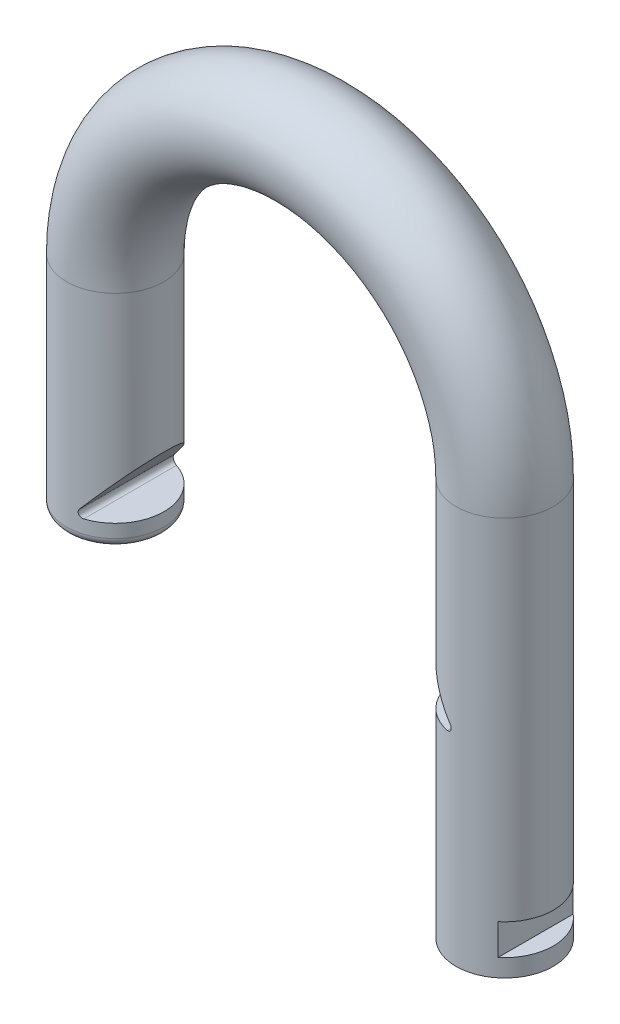
ISO-10303-21;
HEADER;
FILE_DESCRIPTION(('STEP AP214'),'2;1');
FILE_NAME('part.step','',(''),(''),'','','');
FILE_SCHEMA(('AUTOMOTIVE_DESIGN { 1 0 10303 214 1 1 1 1 }'));
ENDSEC;
DATA;
#1=APPLICATION_CONTEXT('core data for automotive mechanical design processes');
#2=APPLICATION_PROTOCOL_DEFINITION('international standard','automotive_design',2000,#1);
#3=PRODUCT_CONTEXT('',#1,'mechanical');
#4=PRODUCT('Part','Part','',(#3));
#5=PRODUCT_RELATED_PRODUCT_CATEGORY('part','',(#4));
#6=PRODUCT_DEFINITION_FORMATION('','',#4);
#7=PRODUCT_DEFINITION_CONTEXT('part definition',#1,'design');
#8=PRODUCT_DEFINITION('design','',#6,#7);
#9=PRODUCT_DEFINITION_SHAPE('','',#8);
#10=(LENGTH_UNIT() NAMED_UNIT(*) SI_UNIT(.MILLI.,.METRE.));
#11=(NAMED_UNIT(*) PLANE_ANGLE_UNIT() SI_UNIT($,.RADIAN.));
#12=(NAMED_UNIT(*) SI_UNIT($,.STERADIAN.) SOLID_ANGLE_UNIT());
#13=UNCERTAINTY_MEASURE_WITH_UNIT(LENGTH_MEASURE(1.E-05),#10,'distance_accuracy_value','');
#14=(GEOMETRIC_REPRESENTATION_CONTEXT(3) GLOBAL_UNCERTAINTY_ASSIGNED_CONTEXT((#13)) GLOBAL_UNIT_ASSIGNED_CONTEXT((#10,
#11,#12)) REPRESENTATION_CONTEXT('',''));
#15=CARTESIAN_POINT('',(0.,0.,0.));
#16=DIRECTION('',(0.,0.,1.));
#17=DIRECTION('',(1.,0.,0.));
#18=AXIS2_PLACEMENT_3D('',#15,#16,#17);
#19=CARTESIAN_POINT('',(-22.,-25.,0.));
#20=DIRECTION('',(0.,-1.,0.));
#21=DIRECTION('',(1.,0.,0.));
#22=AXIS2_PLACEMENT_3D('',#19,#20,#21);
#23=PLANE('',#22);
#24=CARTESIAN_POINT('',(-22.,-25.,0.));
#25=DIRECTION('',(0.,-1.,0.));
#26=DIRECTION('',(1.,0.,0.));
#27=AXIS2_PLACEMENT_3D('',#24,#25,#26);
#28=CIRCLE('',#27,4.5);
#29=CARTESIAN_POINT('',(-17.5,-25.,0.));
#30=VERTEX_POINT('',#29);
#31=EDGE_CURVE('E162',#30,#30,#28,.T.);
#32=ORIENTED_EDGE('',*,*,#31,.T.);
#33=EDGE_LOOP('',(#32));
#34=FACE_BOUND('',#33,.T.);
#35=ADVANCED_FACE('F53',(#34),#23,.T.);
#36=CARTESIAN_POINT('',(22.,-45.,0.));
#37=DIRECTION('',(0.,1.,0.));
#38=DIRECTION('',(-1.,0.,0.));
#39=AXIS2_PLACEMENT_3D('',#36,#37,#38);
#40=PLANE('',#39);
#41=CARTESIAN_POINT('',(22.,-45.,0.));
#42=DIRECTION('',(0.,1.,0.));
#43=DIRECTION('',(-1.,0.,0.));
#44=AXIS2_PLACEMENT_3D('',#41,#42,#43);
#45=CIRCLE('',#44,5.5);
#46=CARTESIAN_POINT('',(16.5,-45.,0.));
#47=VERTEX_POINT('',#46);
#48=EDGE_CURVE('E159',#47,#47,#45,.T.);
#49=ORIENTED_EDGE('',*,*,#48,.F.);
#50=EDGE_LOOP('',(#49));
#51=FACE_BOUND('',#50,.T.);
#52=ADVANCED_FACE('F210',(#51),#40,.F.);
#53=CARTESIAN_POINT('',(-22.,-25.,0.));
#54=DIRECTION('',(0.,1.,0.));
#55=DIRECTION('',(-1.,0.,0.));
#56=AXIS2_PLACEMENT_3D('',#53,#54,#55);
#57=CYLINDRICAL_SURFACE('',#56,5.5);
#58=CARTESIAN_POINT('',(-22.,-22.5,0.));
#59=DIRECTION('',(0.,-1.,0.));
#60=DIRECTION('',(0.,0.,-1.));
#61=AXIS2_PLACEMENT_3D('',#58,#59,#60);
#62=CIRCLE('',#61,5.5);
#63=CARTESIAN_POINT('',(-20.3246533693922,-22.5,-5.23862707847304));
#64=VERTEX_POINT('',#63);
#65=CARTESIAN_POINT('',(-20.3246533693922,-22.5,5.23862707847304));
#66=VERTEX_POINT('',#65);
#67=EDGE_CURVE('E171',#64,#66,#62,.T.);
#68=ORIENTED_EDGE('',*,*,#67,.T.);
#69=CARTESIAN_POINT('',(-20.3246533693922,-22.5,5.23862707847304));
#70=CARTESIAN_POINT('',(-20.3531942859899,-22.500022551563,5.24776469018888));
#71=CARTESIAN_POINT('',(-20.3818264589905,-22.4975567131978,5.256654524814));
#72=CARTESIAN_POINT('',(-20.4384724439636,-22.4877156708319,5.27375386631707));
#73=CARTESIAN_POINT('',(-20.4664856258961,-22.4803356831304,5.281962701508));
#74=CARTESIAN_POINT('',(-20.5210738413196,-22.4607196271261,5.29750808210329));
#75=CARTESIAN_POINT('',(-20.5476467071644,-22.4484764584815,5.30484333161006));
#76=CARTESIAN_POINT('',(-20.5984249732031,-22.4194086690633,5.31848444992605));
#77=CARTESIAN_POINT('',(-20.6226322679384,-22.4025877560724,5.32479114523842));
#78=CARTESIAN_POINT('',(-20.6671627169849,-22.3653807507671,5.33610887218874));
#79=CARTESIAN_POINT('',(-20.6875830220958,-22.3451213548472,5.34115401081369));
#80=CARTESIAN_POINT('',(-20.7247453973414,-22.3012515366069,5.35014879996462));
#81=CARTESIAN_POINT('',(-20.7414871902606,-22.2776408619522,5.3540983679335));
#82=CARTESIAN_POINT('',(-20.7702255587181,-22.2285772083116,5.36077105391441));
#83=CARTESIAN_POINT('',(-20.7823584667719,-22.2032088551656,5.36352980585013));
#84=CARTESIAN_POINT('',(-20.8022211986994,-22.1507184716995,5.36800058871218));
#85=CARTESIAN_POINT('',(-20.8099517521395,-22.1235967327839,5.36971279307776));
#86=CARTESIAN_POINT('',(-20.8206539880721,-22.0688935717011,5.37207341044266));
#87=CARTESIAN_POINT('',(-20.8237086147636,-22.0413291437847,5.37274036978831));
#88=CARTESIAN_POINT('',(-20.8252227388211,-21.9860684748587,5.37307166188213));
#89=CARTESIAN_POINT('',(-20.823682481169,-21.9583722409551,5.37273604808372));
#90=CARTESIAN_POINT('',(-20.8160816083446,-21.9038080975176,5.37106618628021));
#91=CARTESIAN_POINT('',(-20.8100477031164,-21.8769362664989,5.36973783885517));
#92=CARTESIAN_POINT('',(-20.7936822117252,-21.8246070341276,5.36608489131719));
#93=CARTESIAN_POINT('',(-20.7833518597329,-21.7991492289693,5.36376057729364));
#94=CARTESIAN_POINT('',(-20.7623473596657,-21.7575178621654,5.35894532482004));
#95=CARTESIAN_POINT('',(-20.7526598021991,-21.7408086710189,5.35670251030924));
#96=CARTESIAN_POINT('',(-20.7314815054387,-21.7086904291845,5.35172664907826));
#97=CARTESIAN_POINT('',(-20.7199935103209,-21.693279453872,5.34899434752806));
#98=CARTESIAN_POINT('',(-20.7076755909516,-21.6786061951567,5.34601698667127));
#99=B_SPLINE_CURVE_WITH_KNOTS('',3,(#69,#70,#71,#72,#73,#74,#75,#76,#77,#78,#79,#80,#81,#82,#83,
#84,#85,#86,#87,#88,#89,#90,#91,#92,#93,#94,#95,#96,#97,#98),.UNSPECIFIED.,.F.,.F.,(4,2,2,2,2,2,
2,2,2,2,2,2,2,2,4),(0.,0.089819445792922,0.179726454804668,0.269765215202741,0.359731263882757,
0.446908151506212,0.534091606591066,0.618446450350307,0.702787310598944,0.785614002674696,
0.868436278822065,0.950770155038919,1.03308039685352,1.09128650473437,1.14940474416975),.UNSPECIFIED.);
#100=CARTESIAN_POINT('',(-20.7076755909516,-21.6786061951567,5.34601698667127));
#101=VERTEX_POINT('',#100);
#102=EDGE_CURVE('E179',#66,#101,#99,.T.);
#103=ORIENTED_EDGE('',*,*,#102,.T.);
#104=CARTESIAN_POINT('',(-22.,-23.2187384524373,0.));
#105=DIRECTION('',(-0.766044443118975,0.642787609686543,0.));
#106=DIRECTION('',(0.642787609686543,0.766044443118975,0.));
#107=AXIS2_PLACEMENT_3D('',#104,#105,#106);
#108=ELLIPSE('',#107,8.55648104773221,5.5);
#109=CARTESIAN_POINT('',(-20.7076755909516,-21.6786061951567,-5.34601698667127));
#110=VERTEX_POINT('',#109);
#111=EDGE_CURVE('E168',#101,#110,#108,.T.);
#112=ORIENTED_EDGE('',*,*,#111,.T.);
#113=CARTESIAN_POINT('',(-20.7076755909516,-21.6786061951567,-5.34601698667127));
#114=CARTESIAN_POINT('',(-20.7253144779136,-21.6995856037376,-5.35027858810851));
#115=CARTESIAN_POINT('',(-20.7412367686181,-21.7221073342642,-5.35403719790776));
#116=CARTESIAN_POINT('',(-20.7692259905756,-21.7695519197623,-5.36054185687407));
#117=CARTESIAN_POINT('',(-20.7812943684395,-21.7944738692009,-5.36328828603464));
#118=CARTESIAN_POINT('',(-20.8011758170494,-21.8460737899667,-5.36776709517073));
#119=CARTESIAN_POINT('',(-20.808985309532,-21.8727532168789,-5.36949862252923));
#120=CARTESIAN_POINT('',(-20.8200816081314,-21.9270718787896,-5.3719480369776));
#121=CARTESIAN_POINT('',(-20.8233700085153,-21.954710771926,-5.37266628138255));
#122=CARTESIAN_POINT('',(-20.8253117767726,-22.0099400890561,-5.37309114445747));
#123=CARTESIAN_POINT('',(-20.824001456236,-22.037529179465,-5.37280568833328));
#124=CARTESIAN_POINT('',(-20.8168687500099,-22.0920929251263,-5.37123948172719));
#125=CARTESIAN_POINT('',(-20.81104567388,-22.1190674857071,-5.36995857894435));
#126=CARTESIAN_POINT('',(-20.7950865337713,-22.1715955900931,-5.36640006794409));
#127=CARTESIAN_POINT('',(-20.7849567384116,-22.1971511384476,-5.36412390823039));
#128=CARTESIAN_POINT('',(-20.7607104072627,-22.2461749502945,-5.35857399117198));
#129=CARTESIAN_POINT('',(-20.7465939132444,-22.269643235653,-5.35530024427952));
#130=CARTESIAN_POINT('',(-20.7146871873469,-22.3140499092629,-5.34773233311966));
#131=CARTESIAN_POINT('',(-20.696867229526,-22.3349655073093,-5.34342986693873));
#132=CARTESIAN_POINT('',(-20.6581889295066,-22.3734960342066,-5.33384844162065));
#133=CARTESIAN_POINT('',(-20.6373307379473,-22.3911111266014,-5.32856953089324));
#134=CARTESIAN_POINT('',(-20.5927617217232,-22.4229455333942,-5.31697471943173));
#135=CARTESIAN_POINT('',(-20.5690019419152,-22.437089386023,-5.31064008985625));
#136=CARTESIAN_POINT('',(-20.5196750104844,-22.4612166953199,-5.29710227668523));
#137=CARTESIAN_POINT('',(-20.4941071057525,-22.471198406318,-5.28989873028162));
#138=CARTESIAN_POINT('',(-20.4446283552701,-22.4860054088124,-5.27554816872116));
#139=CARTESIAN_POINT('',(-20.4208232808513,-22.4912603150756,-5.26847380289965));
#140=CARTESIAN_POINT('',(-20.372876840213,-22.4982600465503,-5.25386629094413));
#141=CARTESIAN_POINT('',(-20.3487359908172,-22.5000097699994,-5.24633380020485));
#142=CARTESIAN_POINT('',(-20.3246533693922,-22.5,-5.23862707847304));
#143=B_SPLINE_CURVE_WITH_KNOTS('',3,(#113,#114,#115,#116,#117,#118,#119,#120,#121,#122,#123,
#124,#125,#126,#127,#128,#129,#130,#131,#132,#133,#134,#135,#136,#137,#138,#139,#140,#141,#142),
.UNSPECIFIED.,.F.,.F.,(4,2,2,2,2,2,2,2,2,2,2,2,2,2,4),(0.,0.0831172446899611,0.166203253587353,
0.249358963203957,0.332485342196754,0.414956835402669,0.497440949032709,0.579805412239336,
0.662169012499062,0.745221174599691,0.828269220278354,0.912988351924148,0.997742980498233,
1.07364705089344,1.14944497667795),.UNSPECIFIED.);
#144=EDGE_CURVE('E186',#110,#64,#143,.T.);
#145=ORIENTED_EDGE('',*,*,#144,.T.);
#146=EDGE_LOOP('',(#68,#103,#112,#145));
#147=FACE_BOUND('',#146,.T.);
#148=CARTESIAN_POINT('',(-22.,-24.,0.));
#149=DIRECTION('',(0.,-1.,0.));
#150=DIRECTION('',(1.,0.,0.));
#151=AXIS2_PLACEMENT_3D('',#148,#149,#150);
#152=CIRCLE('',#151,5.5);
#153=CARTESIAN_POINT('',(-16.5,-24.,0.));
#154=VERTEX_POINT('',#153);
#155=EDGE_CURVE('E165',#154,#154,#152,.F.);
#156=ORIENTED_EDGE('',*,*,#155,.T.);
#157=EDGE_LOOP('',(#156));
#158=FACE_BOUND('',#157,.T.);
#159=CARTESIAN_POINT('',(-22.,0.,0.));
#160=DIRECTION('',(0.,-1.,0.));
#161=DIRECTION('',(1.,0.,0.));
#162=AXIS2_PLACEMENT_3D('',#159,#160,#161);
#163=CIRCLE('',#162,5.5);
#164=CARTESIAN_POINT('',(-27.5,0.,0.));
#165=VERTEX_POINT('',#164);
#166=EDGE_CURVE('E151',#165,#165,#163,.T.);
#167=ORIENTED_EDGE('',*,*,#166,.T.);
#168=EDGE_LOOP('',(#167));
#169=FACE_BOUND('',#168,.T.);
#170=ADVANCED_FACE('F192',(#147,#158,#169),#57,.T.);
#171=CARTESIAN_POINT('',(0.,0.,0.));
#172=DIRECTION('',(0.,0.,-1.));
#173=DIRECTION('',(-1.,0.,0.));
#174=AXIS2_PLACEMENT_3D('',#171,#172,#173);
#175=TOROIDAL_SURFACE('',#174,22.,5.5);
#176=CARTESIAN_POINT('',(22.,0.,0.));
#177=DIRECTION('',(0.,1.,0.));
#178=DIRECTION('',(-1.,0.,0.));
#179=AXIS2_PLACEMENT_3D('',#176,#177,#178);
#180=CIRCLE('',#179,5.5);
#181=CARTESIAN_POINT('',(27.5,0.,0.));
#182=VERTEX_POINT('',#181);
#183=EDGE_CURVE('E156',#182,#182,#180,.T.);
#184=CARTESIAN_POINT('',(0.,0.,0.));
#185=DIRECTION('',(0.,0.,-1.));
#186=DIRECTION('',(-1.,0.,0.));
#187=AXIS2_PLACEMENT_3D('',#184,#185,#186);
#188=CIRCLE('',#187,27.5);
#189=EDGE_CURVE('',#165,#182,#188,.T.);
#190=ORIENTED_EDGE('',*,*,#166,.F.);
#191=ORIENTED_EDGE('',*,*,#183,.T.);
#192=ORIENTED_EDGE('',*,*,#189,.T.);
#193=ORIENTED_EDGE('',*,*,#189,.F.);
#194=EDGE_LOOP('',(#190,#192,#191,#193));
#195=FACE_BOUND('',#194,.T.);
#196=ADVANCED_FACE('F216',(#195),#175,.T.);
#197=CARTESIAN_POINT('',(22.,0.,0.));
#198=DIRECTION('',(0.,-1.,0.));
#199=DIRECTION('',(1.,0.,0.));
#200=AXIS2_PLACEMENT_3D('',#197,#198,#199);
#201=CYLINDRICAL_SURFACE('',#200,5.5);
#202=CARTESIAN_POINT('',(22.,-22.5,0.));
#203=DIRECTION('',(0.766044443118974,0.642787609686544,0.));
#204=DIRECTION('',(0.642787609686544,-0.766044443118974,0.));
#205=AXIS2_PLACEMENT_3D('',#202,#203,#204);
#206=ELLIPSE('',#205,8.55648104773221,5.5);
#207=CARTESIAN_POINT('',(21.3107687613047,-21.6786061951567,-5.45664368450117));
#208=VERTEX_POINT('',#207);
#209=CARTESIAN_POINT('',(21.3107687613047,-21.6786061951567,5.45664368450117));
#210=VERTEX_POINT('',#209);
#211=EDGE_CURVE('E227',#208,#210,#206,.T.);
#212=ORIENTED_EDGE('',*,*,#211,.T.);
#213=CARTESIAN_POINT('',(21.3107687613047,-21.6786061951567,5.45664368450117));
#214=CARTESIAN_POINT('',(21.3287299787529,-21.6999723772352,5.4589096903419));
#215=CARTESIAN_POINT('',(21.3448755677556,-21.7228872415483,5.46086130726621));
#216=CARTESIAN_POINT('',(21.373140952345,-21.7710956397247,5.4641795780334));
#217=CARTESIAN_POINT('',(21.3852635943498,-21.7963874754439,5.46554664566994));
#218=CARTESIAN_POINT('',(21.4051202348957,-21.8486769133682,5.4677432854613));
#219=CARTESIAN_POINT('',(21.4128519631883,-21.8756753899614,5.4685725796007));
#220=CARTESIAN_POINT('',(21.4236948798459,-21.9305889311971,5.46972604352594));
#221=CARTESIAN_POINT('',(21.4268070188427,-21.9585038060519,5.47005031723695));
#222=CARTESIAN_POINT('',(21.4283198721341,-22.0144361976606,5.47020861774264));
#223=CARTESIAN_POINT('',(21.4267250072467,-22.0424535934358,5.47004310454479));
#224=CARTESIAN_POINT('',(21.4188801068889,-22.0978252676087,5.46921520886566));
#225=CARTESIAN_POINT('',(21.4126294289591,-22.1251794539515,5.46855275781144));
#226=CARTESIAN_POINT('',(21.3956568926565,-22.1784404363333,5.46670300092223));
#227=CARTESIAN_POINT('',(21.3849356811112,-22.2043474411458,5.46551577101436));
#228=CARTESIAN_POINT('',(21.3593386913877,-22.2539841126444,5.46257432516157));
#229=CARTESIAN_POINT('',(21.3444630444365,-22.2777138480729,5.46082012712533));
#230=CARTESIAN_POINT('',(21.3109819569861,-22.3223502512244,5.45669661682108));
#231=CARTESIAN_POINT('',(21.2923731233637,-22.3432543215348,5.45432674437944));
#232=CARTESIAN_POINT('',(21.2519867357351,-22.3816336421922,5.44893477593634));
#233=CARTESIAN_POINT('',(21.2302093166638,-22.3991090384756,5.44591270770615));
#234=CARTESIAN_POINT('',(21.1840339116943,-22.4302270126905,5.43918607291201));
#235=CARTESIAN_POINT('',(21.1596254939479,-22.4438534950027,5.43547874446739));
#236=CARTESIAN_POINT('',(21.1089712169541,-22.4668305280152,5.4274049727146));
#237=CARTESIAN_POINT('',(21.0827254402953,-22.4761812707661,5.42303855902186));
#238=CARTESIAN_POINT('',(21.0349866631256,-22.4888457773623,5.41472078396018));
#239=CARTESIAN_POINT('',(21.0136991464237,-22.4930295310083,5.41088517781613));
#240=CARTESIAN_POINT('',(20.9708491271677,-22.4986078795114,5.40290020562981));
#241=CARTESIAN_POINT('',(20.9492870263887,-22.500006163043,5.3987512620981));
#242=CARTESIAN_POINT('',(20.9277465397452,-22.5,5.39446684269832));
#243=B_SPLINE_CURVE_WITH_KNOTS('',3,(#213,#214,#215,#216,#217,#218,#219,#220,#221,#222,#223,
#224,#225,#226,#227,#228,#229,#230,#231,#232,#233,#234,#235,#236,#237,#238,#239,#240,#241,#242),
.UNSPECIFIED.,.F.,.F.,(4,2,2,2,2,2,2,2,2,2,2,2,2,2,4),(0.,0.083903439310357,0.167747385910296,
0.25163464324536,0.335504635635565,0.41929588240549,0.503098693740018,0.586889384113204,
0.670677428069336,0.754541975520647,0.838402952627039,0.922609600877212,1.00681246650056,
1.07273128066602,1.13856274328547),.UNSPECIFIED.);
#244=CARTESIAN_POINT('',(20.9277465397452,-22.5,5.39446684269832));
#245=VERTEX_POINT('',#244);
#246=EDGE_CURVE('E67',#210,#245,#243,.T.);
#247=ORIENTED_EDGE('',*,*,#246,.T.);
#248=CARTESIAN_POINT('',(22.,-22.5,0.));
#249=DIRECTION('',(0.,-1.,0.));
#250=DIRECTION('',(0.,0.,-1.));
#251=AXIS2_PLACEMENT_3D('',#248,#249,#250);
#252=CIRCLE('',#251,5.5);
#253=CARTESIAN_POINT('',(20.9277465397452,-22.5,-5.39446684269832));
#254=VERTEX_POINT('',#253);
#255=EDGE_CURVE('E139',#245,#254,#252,.T.);
#256=ORIENTED_EDGE('',*,*,#255,.T.);
#257=CARTESIAN_POINT('',(20.9277465397452,-22.5,-5.39446684269832));
#258=CARTESIAN_POINT('',(20.9558756391049,-22.5000242321586,-5.40006689266161));
#259=CARTESIAN_POINT('',(20.9840533453058,-22.4976272797476,-5.40543040917255));
#260=CARTESIAN_POINT('',(21.0397028857107,-22.4881148333304,-5.41558897784766));
#261=CARTESIAN_POINT('',(21.067174788062,-22.4809997966595,-5.420384085056));
#262=CARTESIAN_POINT('',(21.1206404524423,-22.4621661404211,-5.42931574544452));
#263=CARTESIAN_POINT('',(21.1466328043198,-22.4504432104987,-5.43345167690685));
#264=CARTESIAN_POINT('',(21.1963150380691,-22.4227050327951,-5.44102201853974));
#265=CARTESIAN_POINT('',(21.2200059334541,-22.4066916862065,-5.44445673825007));
#266=CARTESIAN_POINT('',(21.2640916805081,-22.3710334971277,-5.45058984237723));
#267=CARTESIAN_POINT('',(21.2845238226662,-22.3514362400298,-5.45329684419811));
#268=CARTESIAN_POINT('',(21.3218263459245,-22.3090284688951,-5.45806146482139));
#269=CARTESIAN_POINT('',(21.3386962060944,-22.286217485711,-5.46011898866908));
#270=CARTESIAN_POINT('',(21.3682138951935,-22.2382719105059,-5.46361290645277));
#271=CARTESIAN_POINT('',(21.3809006747765,-22.2131617088874,-5.46505506971731));
#272=CARTESIAN_POINT('',(21.40189512572,-22.1611505452868,-5.46739268631762));
#273=CARTESIAN_POINT('',(21.4102030948949,-22.1342497052311,-5.4682881768347));
#274=CARTESIAN_POINT('',(21.4221758606652,-22.0795118267394,-5.46956632459768));
#275=CARTESIAN_POINT('',(21.4258552518623,-22.0516780165491,-5.46995059402219));
#276=CARTESIAN_POINT('',(21.4285108890881,-21.9957836215151,-5.47022870346085));
#277=CARTESIAN_POINT('',(21.427487092879,-21.9677230346371,-5.47012253907059));
#278=CARTESIAN_POINT('',(21.4207690647692,-21.9121875379415,-5.46941520810083));
#279=CARTESIAN_POINT('',(21.4150768682183,-21.8847123782417,-5.46881425724008));
#280=CARTESIAN_POINT('',(21.3991895371502,-21.8311156490565,-5.46709155147751));
#281=CARTESIAN_POINT('',(21.3889959745947,-21.8049936105909,-5.46596997837979));
#282=CARTESIAN_POINT('',(21.3678053518878,-21.761760412499,-5.46355284233099));
#283=CARTESIAN_POINT('',(21.3578008721918,-21.7441473509513,-5.46239003567542));
#284=CARTESIAN_POINT('',(21.3357651707135,-21.7102944890597,-5.45975400013269));
#285=CARTESIAN_POINT('',(21.3237364505193,-21.6940530304272,-5.4582811538405));
#286=CARTESIAN_POINT('',(21.3107687613047,-21.6786061951567,-5.45664368450117));
#287=B_SPLINE_CURVE_WITH_KNOTS('',3,(#257,#258,#259,#260,#261,#262,#263,#264,#265,#266,#267,
#268,#269,#270,#271,#272,#273,#274,#275,#276,#277,#278,#279,#280,#281,#282,#283,#284,#285,#286),
.UNSPECIFIED.,.F.,.F.,(4,2,2,2,2,2,2,2,2,2,2,2,2,2,4),(0.,0.0859450697510039,0.171881809857943,
0.257899129690117,0.343878395924552,0.428789542501741,0.513713097478665,0.597821955349412,
0.681925092016957,0.765762368668507,0.849600398234579,0.933401895141887,1.0171741501048,
1.07789949039444,1.13855032917283),.UNSPECIFIED.);
#288=EDGE_CURVE('E12',#254,#208,#287,.T.);
#289=ORIENTED_EDGE('',*,*,#288,.T.);
#290=EDGE_LOOP('',(#212,#247,#256,#289));
#291=FACE_BOUND('',#290,.T.);
#292=DIRECTION('',(0.,-1.,0.));
#293=VECTOR('',#292,1.);
#294=CARTESIAN_POINT('',(25.5,0.,-4.24264068711924));
#295=LINE('',#294,#293);
#296=CARTESIAN_POINT('',(25.5,-39.5,-4.24264068711928));
#297=VERTEX_POINT('',#296);
#298=CARTESIAN_POINT('',(25.5,-43.,-4.24264068711924));
#299=VERTEX_POINT('',#298);
#300=EDGE_CURVE('E232',#297,#299,#295,.T.);
#301=ORIENTED_EDGE('',*,*,#300,.T.);
#302=CARTESIAN_POINT('',(22.,-43.,0.));
#303=DIRECTION('',(0.,-1.,0.));
#304=DIRECTION('',(0.,0.,-1.));
#305=AXIS2_PLACEMENT_3D('',#302,#303,#304);
#306=CIRCLE('',#305,5.5);
#307=CARTESIAN_POINT('',(25.5,-43.,4.24264068711925));
#308=VERTEX_POINT('',#307);
#309=EDGE_CURVE('E140',#299,#308,#306,.T.);
#310=ORIENTED_EDGE('',*,*,#309,.T.);
#311=DIRECTION('',(0.,-1.,0.));
#312=VECTOR('',#311,1.);
#313=CARTESIAN_POINT('',(25.5,0.,4.24264068711924));
#314=LINE('',#313,#312);
#315=CARTESIAN_POINT('',(25.5,-39.5,4.24264068711928));
#316=VERTEX_POINT('',#315);
#317=EDGE_CURVE('E235',#308,#316,#314,.F.);
#318=ORIENTED_EDGE('',*,*,#317,.T.);
#319=CARTESIAN_POINT('',(22.,-39.5,0.));
#320=DIRECTION('',(0.,1.,0.));
#321=DIRECTION('',(-1.,0.,0.));
#322=AXIS2_PLACEMENT_3D('',#319,#320,#321);
#323=CIRCLE('',#322,5.5);
#324=EDGE_CURVE('E238',#316,#297,#323,.T.);
#325=ORIENTED_EDGE('',*,*,#324,.T.);
#326=EDGE_LOOP('',(#301,#310,#318,#325));
#327=FACE_BOUND('',#326,.T.);
#328=CARTESIAN_POINT('',(22.,-30.5207259421637,0.));
#329=DIRECTION('',(0.499999999999997,0.86602540378444,0.));
#330=DIRECTION('',(0.86602540378444,-0.499999999999997,0.));
#331=AXIS2_PLACEMENT_3D('',#328,#329,#330);
#332=ELLIPSE('',#331,6.35085296108587,5.5);
#333=CARTESIAN_POINT('',(18.5,-28.5,-4.24264068711929));
#334=VERTEX_POINT('',#333);
#335=CARTESIAN_POINT('',(18.5,-28.5,4.24264068711929));
#336=VERTEX_POINT('',#335);
#337=EDGE_CURVE('E127',#334,#336,#332,.T.);
#338=ORIENTED_EDGE('',*,*,#337,.T.);
#339=DIRECTION('',(0.,-1.,0.));
#340=VECTOR('',#339,1.);
#341=CARTESIAN_POINT('',(18.5,0.,4.24264068711926));
#342=LINE('',#341,#340);
#343=CARTESIAN_POINT('',(18.5,-43.,4.24264068711929));
#344=VERTEX_POINT('',#343);
#345=EDGE_CURVE('E133',#336,#344,#342,.T.);
#346=ORIENTED_EDGE('',*,*,#345,.T.);
#347=CARTESIAN_POINT('',(22.,-43.,0.));
#348=DIRECTION('',(0.,-1.,0.));
#349=DIRECTION('',(0.,0.,-1.));
#350=AXIS2_PLACEMENT_3D('',#347,#348,#349);
#351=CIRCLE('',#350,5.5);
#352=CARTESIAN_POINT('',(18.5,-43.,-4.24264068711929));
#353=VERTEX_POINT('',#352);
#354=EDGE_CURVE('E129',#344,#353,#351,.T.);
#355=ORIENTED_EDGE('',*,*,#354,.T.);
#356=DIRECTION('',(0.,-1.,0.));
#357=VECTOR('',#356,1.);
#358=CARTESIAN_POINT('',(18.5,0.,-4.24264068711926));
#359=LINE('',#358,#357);
#360=EDGE_CURVE('E122',#353,#334,#359,.F.);
#361=ORIENTED_EDGE('',*,*,#360,.T.);
#362=EDGE_LOOP('',(#338,#346,#355,#361));
#363=FACE_BOUND('',#362,.T.);
#364=ORIENTED_EDGE('',*,*,#48,.T.);
#365=EDGE_LOOP('',(#364));
#366=FACE_BOUND('',#365,.T.);
#367=ORIENTED_EDGE('',*,*,#183,.F.);
#368=EDGE_LOOP('',(#367));
#369=FACE_BOUND('',#368,.T.);
#370=ADVANCED_FACE('F124',(#291,#327,#363,#366,#369),#201,.T.);
#371=CARTESIAN_POINT('',(-22.,-24.,0.));
#372=DIRECTION('',(0.,-1.,0.));
#373=DIRECTION('',(1.,0.,0.));
#374=AXIS2_PLACEMENT_3D('',#371,#372,#373);
#375=TOROIDAL_SURFACE('',#374,4.5,1.);
#376=ORIENTED_EDGE('',*,*,#155,.F.);
#377=EDGE_LOOP('',(#376));
#378=FACE_BOUND('',#377,.T.);
#379=ORIENTED_EDGE('',*,*,#31,.F.);
#380=EDGE_LOOP('',(#379));
#381=FACE_BOUND('',#380,.T.);
#382=ADVANCED_FACE('F202',(#378,#381),#375,.T.);
#383=CARTESIAN_POINT('',(-16.5,-22.5,-5.5));
#384=DIRECTION('',(0.,-1.,0.));
#385=DIRECTION('',(0.,0.,-1.));
#386=AXIS2_PLACEMENT_3D('',#383,#384,#385);
#387=PLANE('',#386);
#388=ORIENTED_EDGE('',*,*,#67,.F.);
#389=DIRECTION('',(0.,0.,1.));
#390=VECTOR('',#389,1.);
#391=CARTESIAN_POINT('',(-20.3246533693922,-22.5,5.46683442477212));
#392=LINE('',#391,#390);
#393=EDGE_CURVE('E174',#64,#66,#392,.T.);
#394=ORIENTED_EDGE('',*,*,#393,.T.);
#395=EDGE_LOOP('',(#388,#394));
#396=FACE_BOUND('',#395,.T.);
#397=ADVANCED_FACE('F206',(#396),#387,.F.);
#398=CARTESIAN_POINT('',(-21.3969068296469,-22.5,-5.5));
#399=DIRECTION('',(-0.766044443118975,0.642787609686543,0.));
#400=DIRECTION('',(-0.642787609686543,-0.766044443118975,0.));
#401=AXIS2_PLACEMENT_3D('',#398,#399,#400);
#402=PLANE('',#401);
#403=ORIENTED_EDGE('',*,*,#111,.F.);
#404=DIRECTION('',(0.,0.,1.));
#405=VECTOR('',#404,1.);
#406=CARTESIAN_POINT('',(-20.7076755909516,-21.6786061951567,-5.46683442477212));
#407=LINE('',#406,#405);
#408=EDGE_CURVE('E177',#101,#110,#407,.F.);
#409=ORIENTED_EDGE('',*,*,#408,.T.);
#410=EDGE_LOOP('',(#403,#409));
#411=FACE_BOUND('',#410,.T.);
#412=ADVANCED_FACE('F200',(#411),#402,.F.);
#413=CARTESIAN_POINT('',(-20.3246533693922,-22.,-5.5));
#414=DIRECTION('',(0.,0.,-1.));
#415=DIRECTION('',(-1.,0.,0.));
#416=AXIS2_PLACEMENT_3D('',#413,#414,#415);
#417=CYLINDRICAL_SURFACE('',#416,0.5);
#418=ORIENTED_EDGE('',*,*,#144,.F.);
#419=ORIENTED_EDGE('',*,*,#408,.F.);
#420=ORIENTED_EDGE('',*,*,#102,.F.);
#421=ORIENTED_EDGE('',*,*,#393,.F.);
#422=EDGE_LOOP('',(#418,#419,#420,#421));
#423=FACE_BOUND('',#422,.T.);
#424=ADVANCED_FACE('F196',(#423),#417,.F.);
#425=CARTESIAN_POINT('',(18.5,-43.,-5.5));
#426=DIRECTION('',(1.,0.,0.));
#427=DIRECTION('',(0.,1.,0.));
#428=AXIS2_PLACEMENT_3D('',#425,#426,#427);
#429=PLANE('',#428);
#430=ORIENTED_EDGE('',*,*,#345,.F.);
#431=DIRECTION('',(0.,0.,1.));
#432=VECTOR('',#431,1.);
#433=CARTESIAN_POINT('',(18.5,-28.5,-5.5));
#434=LINE('',#433,#432);
#435=EDGE_CURVE('E138',#334,#336,#434,.T.);
#436=ORIENTED_EDGE('',*,*,#435,.F.);
#437=ORIENTED_EDGE('',*,*,#360,.F.);
#438=DIRECTION('',(0.,0.,1.));
#439=VECTOR('',#438,1.);
#440=CARTESIAN_POINT('',(18.5,-43.,-5.5));
#441=LINE('',#440,#439);
#442=EDGE_CURVE('E143',#353,#344,#441,.T.);
#443=ORIENTED_EDGE('',*,*,#442,.T.);
#444=EDGE_LOOP('',(#430,#436,#437,#443));
#445=FACE_BOUND('',#444,.T.);
#446=ADVANCED_FACE('F142',(#445),#429,.F.);
#447=CARTESIAN_POINT('',(16.5,-43.,-5.5));
#448=DIRECTION('',(0.,-1.,0.));
#449=DIRECTION('',(0.,0.,-1.));
#450=AXIS2_PLACEMENT_3D('',#447,#448,#449);
#451=PLANE('',#450);
#452=ORIENTED_EDGE('',*,*,#442,.F.);
#453=ORIENTED_EDGE('',*,*,#354,.F.);
#454=EDGE_LOOP('',(#452,#453));
#455=FACE_BOUND('',#454,.T.);
#456=ADVANCED_FACE('F258',(#455),#451,.F.);
#457=CARTESIAN_POINT('',(27.5,-43.,-5.5));
#458=DIRECTION('',(0.,-1.,0.));
#459=DIRECTION('',(0.,0.,-1.));
#460=AXIS2_PLACEMENT_3D('',#457,#458,#459);
#461=PLANE('',#460);
#462=DIRECTION('',(0.,0.,1.));
#463=VECTOR('',#462,1.);
#464=CARTESIAN_POINT('',(25.5,-43.,-5.5));
#465=LINE('',#464,#463);
#466=EDGE_CURVE('E148',#299,#308,#465,.T.);
#467=ORIENTED_EDGE('',*,*,#466,.T.);
#468=ORIENTED_EDGE('',*,*,#309,.F.);
#469=EDGE_LOOP('',(#467,#468));
#470=FACE_BOUND('',#469,.T.);
#471=ADVANCED_FACE('F261',(#470),#461,.F.);
#472=CARTESIAN_POINT('',(25.5,-43.,-5.5));
#473=DIRECTION('',(-1.,0.,0.));
#474=DIRECTION('',(0.,-1.,0.));
#475=AXIS2_PLACEMENT_3D('',#472,#473,#474);
#476=PLANE('',#475);
#477=DIRECTION('',(0.,0.,1.));
#478=VECTOR('',#477,1.);
#479=CARTESIAN_POINT('',(25.5,-39.5,-5.5));
#480=LINE('',#479,#478);
#481=EDGE_CURVE('E145',#297,#316,#480,.T.);
#482=ORIENTED_EDGE('',*,*,#481,.T.);
#483=ORIENTED_EDGE('',*,*,#317,.F.);
#484=ORIENTED_EDGE('',*,*,#466,.F.);
#485=ORIENTED_EDGE('',*,*,#300,.F.);
#486=EDGE_LOOP('',(#482,#483,#484,#485));
#487=FACE_BOUND('',#486,.T.);
#488=ADVANCED_FACE('F266',(#487),#476,.F.);
#489=CARTESIAN_POINT('',(25.5,-39.5,-5.5));
#490=DIRECTION('',(0.,1.,0.));
#491=DIRECTION('',(-1.,0.,0.));
#492=AXIS2_PLACEMENT_3D('',#489,#490,#491);
#493=PLANE('',#492);
#494=ORIENTED_EDGE('',*,*,#481,.F.);
#495=ORIENTED_EDGE('',*,*,#324,.F.);
#496=EDGE_LOOP('',(#494,#495));
#497=FACE_BOUND('',#496,.T.);
#498=ADVANCED_FACE('F263',(#497),#493,.F.);
#499=CARTESIAN_POINT('',(18.5,-28.5,-5.5));
#500=DIRECTION('',(0.499999999999997,0.86602540378444,0.));
#501=DIRECTION('',(-0.86602540378444,0.499999999999997,0.));
#502=AXIS2_PLACEMENT_3D('',#499,#500,#501);
#503=PLANE('',#502);
#504=ORIENTED_EDGE('',*,*,#435,.T.);
#505=ORIENTED_EDGE('',*,*,#337,.F.);
#506=EDGE_LOOP('',(#504,#505));
#507=FACE_BOUND('',#506,.T.);
#508=ADVANCED_FACE('F137',(#507),#503,.F.);
#509=CARTESIAN_POINT('',(22.,-22.5,-5.5));
#510=DIRECTION('',(0.766044443118974,0.642787609686544,0.));
#511=DIRECTION('',(-0.642787609686544,0.766044443118974,0.));
#512=AXIS2_PLACEMENT_3D('',#509,#510,#511);
#513=PLANE('',#512);
#514=ORIENTED_EDGE('',*,*,#211,.F.);
#515=DIRECTION('',(0.,0.,1.));
#516=VECTOR('',#515,1.);
#517=CARTESIAN_POINT('',(21.3107687613047,-21.6786061951567,5.5));
#518=LINE('',#517,#516);
#519=EDGE_CURVE('E224',#208,#210,#518,.T.);
#520=ORIENTED_EDGE('',*,*,#519,.T.);
#521=EDGE_LOOP('',(#514,#520));
#522=FACE_BOUND('',#521,.T.);
#523=ADVANCED_FACE('F276',(#522),#513,.F.);
#524=CARTESIAN_POINT('',(16.5,-22.5,-5.5));
#525=DIRECTION('',(0.,-1.,0.));
#526=DIRECTION('',(0.,0.,-1.));
#527=AXIS2_PLACEMENT_3D('',#524,#525,#526);
#528=PLANE('',#527);
#529=ORIENTED_EDGE('',*,*,#255,.F.);
#530=DIRECTION('',(0.,0.,1.));
#531=VECTOR('',#530,1.);
#532=CARTESIAN_POINT('',(20.9277465397452,-22.5,-5.5));
#533=LINE('',#532,#531);
#534=EDGE_CURVE('E73',#245,#254,#533,.F.);
#535=ORIENTED_EDGE('',*,*,#534,.T.);
#536=EDGE_LOOP('',(#529,#535));
#537=FACE_BOUND('',#536,.T.);
#538=ADVANCED_FACE('F277',(#537),#528,.F.);
#539=CARTESIAN_POINT('',(20.9277465397452,-22.,-5.5));
#540=DIRECTION('',(0.,0.,-1.));
#541=DIRECTION('',(-1.,0.,0.));
#542=AXIS2_PLACEMENT_3D('',#539,#540,#541);
#543=CYLINDRICAL_SURFACE('',#542,0.5);
#544=ORIENTED_EDGE('',*,*,#288,.F.);
#545=ORIENTED_EDGE('',*,*,#534,.F.);
#546=ORIENTED_EDGE('',*,*,#246,.F.);
#547=ORIENTED_EDGE('',*,*,#519,.F.);
#548=EDGE_LOOP('',(#544,#545,#546,#547));
#549=FACE_BOUND('',#548,.T.);
#550=ADVANCED_FACE('F55',(#549),#543,.F.);
#551=CLOSED_SHELL('',(#35,#52,#170,#196,#370,#382,#397,#412,#424,#446,#456,#471,#488,#498,#508,
#523,#538,#550));
#552=MANIFOLD_SOLID_BREP('B2',#551);
#553=ADVANCED_BREP_SHAPE_REPRESENTATION('',(#18,#552),#14);
#554=SHAPE_DEFINITION_REPRESENTATION(#9,#553);
ENDSEC;
END-ISO-10303-21;
